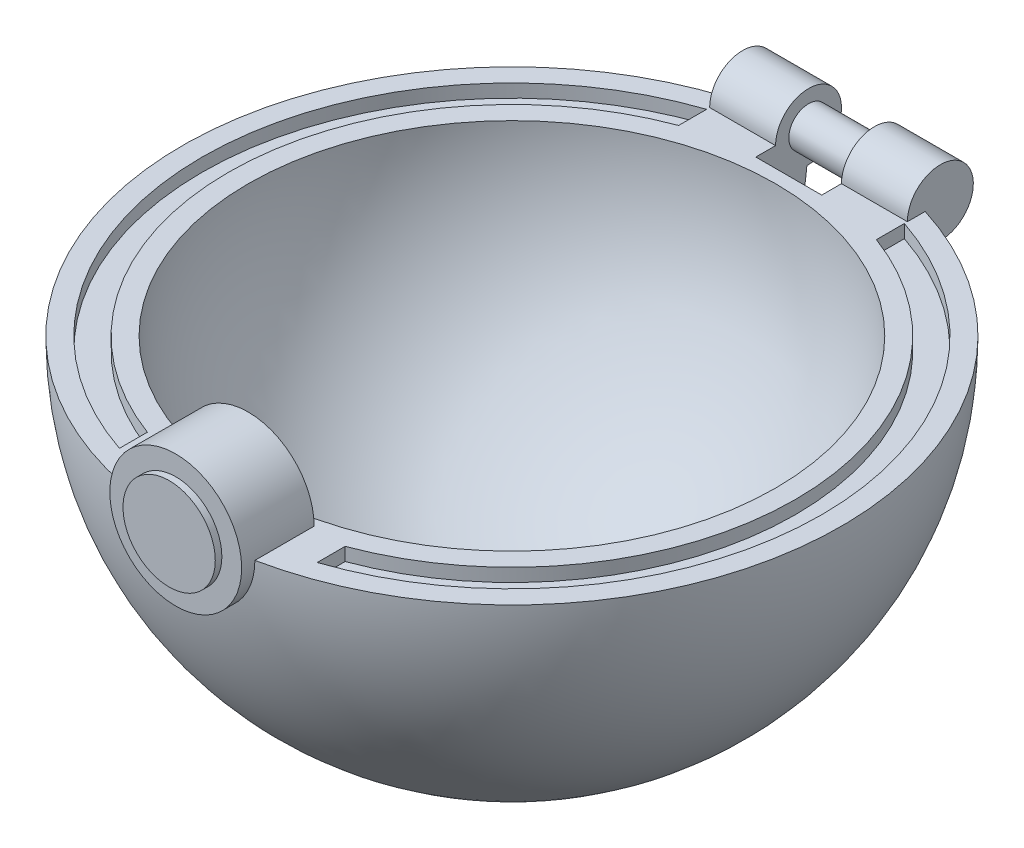
ISO-10303-21;
HEADER;
FILE_DESCRIPTION(('STEP AP214'),'2;1');
FILE_NAME('part.step','',(''),(''),'','','');
FILE_SCHEMA(('AUTOMOTIVE_DESIGN { 1 0 10303 214 1 1 1 1 }'));
ENDSEC;
DATA;
#1=APPLICATION_CONTEXT('core data for automotive mechanical design processes');
#2=APPLICATION_PROTOCOL_DEFINITION('international standard','automotive_design',2000,#1);
#3=PRODUCT_CONTEXT('',#1,'mechanical');
#4=PRODUCT('Part','Part','',(#3));
#5=PRODUCT_RELATED_PRODUCT_CATEGORY('part','',(#4));
#6=PRODUCT_DEFINITION_FORMATION('','',#4);
#7=PRODUCT_DEFINITION_CONTEXT('part definition',#1,'design');
#8=PRODUCT_DEFINITION('design','',#6,#7);
#9=PRODUCT_DEFINITION_SHAPE('','',#8);
#10=(LENGTH_UNIT() NAMED_UNIT(*) SI_UNIT(.MILLI.,.METRE.));
#11=(NAMED_UNIT(*) PLANE_ANGLE_UNIT() SI_UNIT($,.RADIAN.));
#12=(NAMED_UNIT(*) SI_UNIT($,.STERADIAN.) SOLID_ANGLE_UNIT());
#13=UNCERTAINTY_MEASURE_WITH_UNIT(LENGTH_MEASURE(1.E-05),#10,'distance_accuracy_value','');
#14=(GEOMETRIC_REPRESENTATION_CONTEXT(3) GLOBAL_UNCERTAINTY_ASSIGNED_CONTEXT((#13)) GLOBAL_UNIT_ASSIGNED_CONTEXT((#10,
#11,#12)) REPRESENTATION_CONTEXT('',''));
#15=CARTESIAN_POINT('',(0.,0.,0.));
#16=DIRECTION('',(0.,0.,1.));
#17=DIRECTION('',(1.,0.,0.));
#18=AXIS2_PLACEMENT_3D('',#15,#16,#17);
#19=CARTESIAN_POINT('',(-15.,-8.,-49.3558507170123));
#20=DIRECTION('',(0.,-1.,0.));
#21=DIRECTION('',(0.,0.,-1.));
#22=AXIS2_PLACEMENT_3D('',#19,#20,#21);
#23=PLANE('',#22);
#24=DIRECTION('',(1.,0.,0.));
#25=VECTOR('',#24,1.);
#26=CARTESIAN_POINT('',(-15.,-8.,-49.3558507170123));
#27=LINE('',#26,#25);
#28=CARTESIAN_POINT('',(-15.,-8.,-49.3558507170123));
#29=VERTEX_POINT('',#28);
#30=CARTESIAN_POINT('',(-5.,-8.,-49.3558507170123));
#31=VERTEX_POINT('',#30);
#32=EDGE_CURVE('E261',#29,#31,#27,.T.);
#33=ORIENTED_EDGE('',*,*,#32,.T.);
#34=DIRECTION('',(0.,0.,-1.));
#35=VECTOR('',#34,1.);
#36=CARTESIAN_POINT('',(-5.,-8.,-49.3558507170123));
#37=LINE('',#36,#35);
#38=CARTESIAN_POINT('',(-5.,-8.,-49.1019347887637));
#39=VERTEX_POINT('',#38);
#40=EDGE_CURVE('E226',#39,#31,#37,.T.);
#41=ORIENTED_EDGE('',*,*,#40,.F.);
#42=CARTESIAN_POINT('',(0.,-8.00000000000001,0.));
#43=DIRECTION('',(0.,-1.,0.));
#44=DIRECTION('',(0.,0.,-1.));
#45=AXIS2_PLACEMENT_3D('',#42,#43,#44);
#46=CIRCLE('',#45,49.3558507170123);
#47=CARTESIAN_POINT('',(-15.,-8.,-47.021271782035));
#48=VERTEX_POINT('',#47);
#49=EDGE_CURVE('E58',#39,#48,#46,.F.);
#50=ORIENTED_EDGE('',*,*,#49,.T.);
#51=DIRECTION('',(0.,0.,-1.));
#52=VECTOR('',#51,1.);
#53=CARTESIAN_POINT('',(-15.,-8.,-49.3558507170123));
#54=LINE('',#53,#52);
#55=EDGE_CURVE('E250',#48,#29,#54,.T.);
#56=ORIENTED_EDGE('',*,*,#55,.T.);
#57=EDGE_LOOP('',(#33,#41,#50,#56));
#58=FACE_BOUND('',#57,.T.);
#59=ADVANCED_FACE('F35',(#58),#23,.T.);
#60=CARTESIAN_POINT('',(-15.,0.,0.));
#61=DIRECTION('',(1.,0.,0.));
#62=DIRECTION('',(0.,0.,-1.));
#63=AXIS2_PLACEMENT_3D('',#60,#61,#62);
#64=CYLINDRICAL_SURFACE('',#63,50.);
#65=DIRECTION('',(1.,0.,0.));
#66=VECTOR('',#65,1.);
#67=CARTESIAN_POINT('',(-15.,-5.00000000000001,-49.749371855331));
#68=LINE('',#67,#66);
#69=CARTESIAN_POINT('',(-15.,-5.00000000000001,-49.749371855331));
#70=VERTEX_POINT('',#69);
#71=CARTESIAN_POINT('',(-5.,-5.00000000000001,-49.749371855331));
#72=VERTEX_POINT('',#71);
#73=EDGE_CURVE('E256',#70,#72,#68,.T.);
#74=ORIENTED_EDGE('',*,*,#73,.T.);
#75=CARTESIAN_POINT('',(-5.,0.,0.));
#76=DIRECTION('',(1.,0.,0.));
#77=DIRECTION('',(0.,0.,-1.));
#78=AXIS2_PLACEMENT_3D('',#75,#76,#77);
#79=CIRCLE('',#78,50.);
#80=EDGE_CURVE('E225',#31,#72,#79,.T.);
#81=ORIENTED_EDGE('',*,*,#80,.F.);
#82=ORIENTED_EDGE('',*,*,#32,.F.);
#83=CARTESIAN_POINT('',(-15.,0.,0.));
#84=DIRECTION('',(1.,0.,0.));
#85=DIRECTION('',(0.,0.,-1.));
#86=AXIS2_PLACEMENT_3D('',#83,#84,#85);
#87=CIRCLE('',#86,50.);
#88=EDGE_CURVE('E252',#29,#70,#87,.T.);
#89=ORIENTED_EDGE('',*,*,#88,.T.);
#90=EDGE_LOOP('',(#74,#81,#82,#89));
#91=FACE_BOUND('',#90,.T.);
#92=ADVANCED_FACE('F478',(#91),#64,.T.);
#93=CARTESIAN_POINT('',(0.,0.,0.));
#94=DIRECTION('',(0.,-1.,0.));
#95=DIRECTION('',(0.,0.,1.));
#96=AXIS2_PLACEMENT_3D('',#93,#94,#95);
#97=SPHERICAL_SURFACE('',#96,50.);
#98=CARTESIAN_POINT('',(0.,-49.,0.));
#99=DIRECTION('',(0.,1.,0.));
#100=DIRECTION('',(0.,0.,1.));
#101=AXIS2_PLACEMENT_3D('',#98,#99,#100);
#102=CIRCLE('',#101,9.94987437106621);
#103=CARTESIAN_POINT('',(0.,-49.,9.94987437106621));
#104=VERTEX_POINT('',#103);
#105=EDGE_CURVE('E39',#104,#104,#102,.F.);
#106=ORIENTED_EDGE('',*,*,#105,.F.);
#107=EDGE_LOOP('',(#106));
#108=FACE_BOUND('',#107,.T.);
#109=CARTESIAN_POINT('',(-15.,0.,0.));
#110=DIRECTION('',(1.,0.,0.));
#111=DIRECTION('',(0.,0.,-1.));
#112=AXIS2_PLACEMENT_3D('',#109,#110,#111);
#113=CIRCLE('',#112,47.6969600708473);
#114=CARTESIAN_POINT('',(-15.,0.,-47.6969600708473));
#115=VERTEX_POINT('',#114);
#116=EDGE_CURVE('E385',#115,#48,#113,.F.);
#117=ORIENTED_EDGE('',*,*,#116,.T.);
#118=ORIENTED_EDGE('',*,*,#49,.F.);
#119=CARTESIAN_POINT('',(5.,-8.,-49.1019347887637));
#120=VERTEX_POINT('',#119);
#121=EDGE_CURVE('E44',#120,#39,#46,.F.);
#122=ORIENTED_EDGE('',*,*,#121,.F.);
#123=CARTESIAN_POINT('',(15.,-8.,-47.021271782035));
#124=VERTEX_POINT('',#123);
#125=EDGE_CURVE('E415',#124,#120,#46,.F.);
#126=ORIENTED_EDGE('',*,*,#125,.F.);
#127=CARTESIAN_POINT('',(15.,0.,0.));
#128=DIRECTION('',(1.,0.,0.));
#129=DIRECTION('',(0.,0.,-1.));
#130=AXIS2_PLACEMENT_3D('',#127,#128,#129);
#131=CIRCLE('',#130,47.6969600708473);
#132=CARTESIAN_POINT('',(15.,0.,-47.6969600708473));
#133=VERTEX_POINT('',#132);
#134=EDGE_CURVE('E387',#133,#124,#131,.F.);
#135=ORIENTED_EDGE('',*,*,#134,.F.);
#136=CARTESIAN_POINT('',(0.,0.,0.));
#137=DIRECTION('',(0.,-1.,0.));
#138=DIRECTION('',(0.,0.,-1.));
#139=AXIS2_PLACEMENT_3D('',#136,#137,#138);
#140=CIRCLE('',#139,50.);
#141=CARTESIAN_POINT('',(10.,0.,48.9897948556636));
#142=VERTEX_POINT('',#141);
#143=EDGE_CURVE('E393',#133,#142,#140,.T.);
#144=ORIENTED_EDGE('',*,*,#143,.T.);
#145=CARTESIAN_POINT('',(0.,0.,48.9897948556636));
#146=DIRECTION('',(0.,0.,-1.));
#147=DIRECTION('',(-1.,0.,0.));
#148=AXIS2_PLACEMENT_3D('',#145,#146,#147);
#149=CIRCLE('',#148,10.);
#150=CARTESIAN_POINT('',(-10.,0.,48.9897948556636));
#151=VERTEX_POINT('',#150);
#152=EDGE_CURVE('E339',#151,#142,#149,.F.);
#153=ORIENTED_EDGE('',*,*,#152,.F.);
#154=EDGE_CURVE('E392',#151,#115,#140,.T.);
#155=ORIENTED_EDGE('',*,*,#154,.T.);
#156=EDGE_LOOP('',(#117,#118,#122,#126,#135,#144,#153,#155));
#157=FACE_BOUND('',#156,.T.);
#158=ADVANCED_FACE('F426',(#108,#157),#97,.T.);
#159=CARTESIAN_POINT('',(-15.,0.,-50.));
#160=DIRECTION('',(1.,0.,0.));
#161=DIRECTION('',(0.,0.,-1.));
#162=AXIS2_PLACEMENT_3D('',#159,#160,#161);
#163=CYLINDRICAL_SURFACE('',#162,5.);
#164=CARTESIAN_POINT('',(-5.,0.,-50.));
#165=DIRECTION('',(1.,0.,0.));
#166=DIRECTION('',(0.,0.,-1.));
#167=AXIS2_PLACEMENT_3D('',#164,#165,#166);
#168=CIRCLE('',#167,5.);
#169=CARTESIAN_POINT('',(-5.,-5.,-50.));
#170=VERTEX_POINT('',#169);
#171=CARTESIAN_POINT('',(-5.,0.,-45.));
#172=VERTEX_POINT('',#171);
#173=EDGE_CURVE('E375',#170,#172,#168,.T.);
#174=ORIENTED_EDGE('',*,*,#173,.F.);
#175=DIRECTION('',(1.,0.,0.));
#176=VECTOR('',#175,1.);
#177=CARTESIAN_POINT('',(-15.,-5.,-50.));
#178=LINE('',#177,#176);
#179=CARTESIAN_POINT('',(-15.,-5.,-50.));
#180=VERTEX_POINT('',#179);
#181=EDGE_CURVE('E345',#180,#170,#178,.T.);
#182=ORIENTED_EDGE('',*,*,#181,.F.);
#183=CARTESIAN_POINT('',(-15.,0.,-50.));
#184=DIRECTION('',(1.,0.,0.));
#185=DIRECTION('',(0.,0.,-1.));
#186=AXIS2_PLACEMENT_3D('',#183,#184,#185);
#187=CIRCLE('',#186,5.);
#188=CARTESIAN_POINT('',(-15.,0.,-45.));
#189=VERTEX_POINT('',#188);
#190=EDGE_CURVE('E383',#180,#189,#187,.T.);
#191=ORIENTED_EDGE('',*,*,#190,.T.);
#192=DIRECTION('',(1.,0.,0.));
#193=VECTOR('',#192,1.);
#194=CARTESIAN_POINT('',(-15.,0.,-45.));
#195=LINE('',#194,#193);
#196=EDGE_CURVE('E354',#172,#189,#195,.F.);
#197=ORIENTED_EDGE('',*,*,#196,.F.);
#198=EDGE_LOOP('',(#174,#182,#191,#197));
#199=FACE_BOUND('',#198,.T.);
#200=ADVANCED_FACE('F445',(#199),#163,.T.);
#201=CARTESIAN_POINT('',(15.,0.,-50.));
#202=DIRECTION('',(1.,0.,0.));
#203=DIRECTION('',(0.,0.,-1.));
#204=AXIS2_PLACEMENT_3D('',#201,#202,#203);
#205=CIRCLE('',#204,5.);
#206=CARTESIAN_POINT('',(15.,-5.,-50.));
#207=VERTEX_POINT('',#206);
#208=CARTESIAN_POINT('',(15.,0.,-45.));
#209=VERTEX_POINT('',#208);
#210=EDGE_CURVE('E380',#207,#209,#205,.T.);
#211=ORIENTED_EDGE('',*,*,#210,.F.);
#212=DIRECTION('',(1.,0.,0.));
#213=VECTOR('',#212,1.);
#214=CARTESIAN_POINT('',(5.,-5.,-50.));
#215=LINE('',#214,#213);
#216=CARTESIAN_POINT('',(5.,-5.,-50.));
#217=VERTEX_POINT('',#216);
#218=EDGE_CURVE('E363',#217,#207,#215,.T.);
#219=ORIENTED_EDGE('',*,*,#218,.F.);
#220=CARTESIAN_POINT('',(5.,0.,-50.));
#221=DIRECTION('',(1.,0.,0.));
#222=DIRECTION('',(0.,0.,-1.));
#223=AXIS2_PLACEMENT_3D('',#220,#221,#222);
#224=CIRCLE('',#223,5.);
#225=CARTESIAN_POINT('',(5.,0.,-45.));
#226=VERTEX_POINT('',#225);
#227=EDGE_CURVE('E377',#217,#226,#224,.T.);
#228=ORIENTED_EDGE('',*,*,#227,.T.);
#229=DIRECTION('',(1.,0.,0.));
#230=VECTOR('',#229,1.);
#231=CARTESIAN_POINT('',(-15.,0.,-45.));
#232=LINE('',#231,#230);
#233=EDGE_CURVE('E370',#209,#226,#232,.F.);
#234=ORIENTED_EDGE('',*,*,#233,.F.);
#235=EDGE_LOOP('',(#211,#219,#228,#234));
#236=FACE_BOUND('',#235,.T.);
#237=ADVANCED_FACE('F468',(#236),#163,.T.);
#238=CARTESIAN_POINT('',(0.,0.,0.));
#239=DIRECTION('',(0.,-1.,0.));
#240=DIRECTION('',(0.,0.,1.));
#241=AXIS2_PLACEMENT_3D('',#238,#239,#240);
#242=SPHERICAL_SURFACE('',#241,40.);
#243=CARTESIAN_POINT('',(0.,0.,0.));
#244=DIRECTION('',(0.,-1.,0.));
#245=DIRECTION('',(0.,0.,-1.));
#246=AXIS2_PLACEMENT_3D('',#243,#244,#245);
#247=CIRCLE('',#246,40.);
#248=CARTESIAN_POINT('',(0.,0.,40.));
#249=VERTEX_POINT('',#248);
#250=EDGE_CURVE('E389',#249,#249,#247,.T.);
#251=ORIENTED_EDGE('',*,*,#250,.F.);
#252=EDGE_LOOP('',(#251));
#253=FACE_BOUND('',#252,.T.);
#254=ADVANCED_FACE('F37',(#253),#242,.F.);
#255=CARTESIAN_POINT('',(0.,0.,0.));
#256=DIRECTION('',(0.,-1.,0.));
#257=DIRECTION('',(0.,0.,-1.));
#258=AXIS2_PLACEMENT_3D('',#255,#256,#257);
#259=PLANE('',#258);
#260=DIRECTION('',(0.,0.,-1.));
#261=VECTOR('',#260,1.);
#262=CARTESIAN_POINT('',(-15.,0.,40.2988833592198));
#263=LINE('',#262,#261);
#264=CARTESIAN_POINT('',(-15.,0.,44.5420948942008));
#265=VERTEX_POINT('',#264);
#266=CARTESIAN_POINT('',(-15.,0.,40.2988833592198));
#267=VERTEX_POINT('',#266);
#268=EDGE_CURVE('E281',#265,#267,#263,.T.);
#269=ORIENTED_EDGE('',*,*,#268,.F.);
#270=CARTESIAN_POINT('',(0.,0.,0.));
#271=DIRECTION('',(0.,1.,0.));
#272=DIRECTION('',(0.,0.,1.));
#273=AXIS2_PLACEMENT_3D('',#270,#271,#272);
#274=CIRCLE('',#273,46.9999810379109);
#275=CARTESIAN_POINT('',(-15.,0.,-44.5420948942008));
#276=VERTEX_POINT('',#275);
#277=EDGE_CURVE('E265',#276,#265,#274,.T.);
#278=ORIENTED_EDGE('',*,*,#277,.F.);
#279=DIRECTION('',(0.,0.,-1.));
#280=VECTOR('',#279,1.);
#281=CARTESIAN_POINT('',(-15.,0.,-44.5420948942008));
#282=LINE('',#281,#280);
#283=CARTESIAN_POINT('',(-15.,0.,-40.2988833592198));
#284=VERTEX_POINT('',#283);
#285=EDGE_CURVE('E270',#284,#276,#282,.T.);
#286=ORIENTED_EDGE('',*,*,#285,.F.);
#287=CARTESIAN_POINT('',(0.,0.,0.));
#288=DIRECTION('',(0.,-1.,0.));
#289=DIRECTION('',(0.,0.,1.));
#290=AXIS2_PLACEMENT_3D('',#287,#288,#289);
#291=CIRCLE('',#290,43.);
#292=EDGE_CURVE('E284',#267,#284,#291,.T.);
#293=ORIENTED_EDGE('',*,*,#292,.F.);
#294=EDGE_LOOP('',(#269,#278,#286,#293));
#295=FACE_BOUND('',#294,.T.);
#296=DIRECTION('',(0.,0.,1.));
#297=VECTOR('',#296,1.);
#298=CARTESIAN_POINT('',(15.,0.,-44.5420948942008));
#299=LINE('',#298,#297);
#300=CARTESIAN_POINT('',(15.,0.,-44.5420948942008));
#301=VERTEX_POINT('',#300);
#302=CARTESIAN_POINT('',(15.,0.,-40.2988833592198));
#303=VERTEX_POINT('',#302);
#304=EDGE_CURVE('E313',#301,#303,#299,.T.);
#305=ORIENTED_EDGE('',*,*,#304,.F.);
#306=CARTESIAN_POINT('',(0.,0.,0.));
#307=DIRECTION('',(0.,1.,0.));
#308=DIRECTION('',(0.,0.,1.));
#309=AXIS2_PLACEMENT_3D('',#306,#307,#308);
#310=CIRCLE('',#309,46.9999810379109);
#311=CARTESIAN_POINT('',(15.,0.,44.5420948942008));
#312=VERTEX_POINT('',#311);
#313=EDGE_CURVE('E291',#312,#301,#310,.T.);
#314=ORIENTED_EDGE('',*,*,#313,.F.);
#315=DIRECTION('',(0.,0.,1.));
#316=VECTOR('',#315,1.);
#317=CARTESIAN_POINT('',(15.,0.,40.2988833592198));
#318=LINE('',#317,#316);
#319=CARTESIAN_POINT('',(15.,0.,40.2988833592198));
#320=VERTEX_POINT('',#319);
#321=EDGE_CURVE('E302',#320,#312,#318,.T.);
#322=ORIENTED_EDGE('',*,*,#321,.F.);
#323=CARTESIAN_POINT('',(0.,0.,0.));
#324=DIRECTION('',(0.,-1.,0.));
#325=DIRECTION('',(0.,0.,1.));
#326=AXIS2_PLACEMENT_3D('',#323,#324,#325);
#327=CIRCLE('',#326,43.);
#328=EDGE_CURVE('E316',#303,#320,#327,.T.);
#329=ORIENTED_EDGE('',*,*,#328,.F.);
#330=EDGE_LOOP('',(#305,#314,#322,#329));
#331=FACE_BOUND('',#330,.T.);
#332=DIRECTION('',(-1.,0.,0.));
#333=VECTOR('',#332,1.);
#334=CARTESIAN_POINT('',(0.,0.,40.));
#335=LINE('',#334,#333);
#336=CARTESIAN_POINT('',(10.,0.,40.));
#337=VERTEX_POINT('',#336);
#338=EDGE_CURVE('E410',#337,#249,#335,.T.);
#339=ORIENTED_EDGE('',*,*,#338,.F.);
#340=DIRECTION('',(0.,0.,1.));
#341=VECTOR('',#340,1.);
#342=CARTESIAN_POINT('',(10.,0.,40.));
#343=LINE('',#342,#341);
#344=EDGE_CURVE('E413',#337,#142,#343,.T.);
#345=ORIENTED_EDGE('',*,*,#344,.T.);
#346=ORIENTED_EDGE('',*,*,#143,.F.);
#347=DIRECTION('',(0.,0.,1.));
#348=VECTOR('',#347,1.);
#349=CARTESIAN_POINT('',(15.,0.,0.));
#350=LINE('',#349,#348);
#351=EDGE_CURVE('E401',#133,#209,#350,.T.);
#352=ORIENTED_EDGE('',*,*,#351,.T.);
#353=ORIENTED_EDGE('',*,*,#233,.T.);
#354=DIRECTION('',(0.,0.,1.));
#355=VECTOR('',#354,1.);
#356=CARTESIAN_POINT('',(5.,0.,-50.));
#357=LINE('',#356,#355);
#358=CARTESIAN_POINT('',(5.,0.,-42.));
#359=VERTEX_POINT('',#358);
#360=EDGE_CURVE('E358',#226,#359,#357,.T.);
#361=ORIENTED_EDGE('',*,*,#360,.T.);
#362=DIRECTION('',(-1.,0.,0.));
#363=VECTOR('',#362,1.);
#364=CARTESIAN_POINT('',(15.,0.,-42.));
#365=LINE('',#364,#363);
#366=CARTESIAN_POINT('',(-5.,0.,-42.));
#367=VERTEX_POINT('',#366);
#368=EDGE_CURVE('E399',#367,#359,#365,.F.);
#369=ORIENTED_EDGE('',*,*,#368,.F.);
#370=DIRECTION('',(0.,0.,1.));
#371=VECTOR('',#370,1.);
#372=CARTESIAN_POINT('',(-5.,0.,-50.));
#373=LINE('',#372,#371);
#374=EDGE_CURVE('E342',#172,#367,#373,.T.);
#375=ORIENTED_EDGE('',*,*,#374,.F.);
#376=ORIENTED_EDGE('',*,*,#196,.T.);
#377=DIRECTION('',(0.,0.,1.));
#378=VECTOR('',#377,1.);
#379=CARTESIAN_POINT('',(-15.,0.,0.));
#380=LINE('',#379,#378);
#381=EDGE_CURVE('E396',#115,#189,#380,.T.);
#382=ORIENTED_EDGE('',*,*,#381,.F.);
#383=ORIENTED_EDGE('',*,*,#154,.F.);
#384=DIRECTION('',(0.,0.,1.));
#385=VECTOR('',#384,1.);
#386=CARTESIAN_POINT('',(-10.,0.,40.));
#387=LINE('',#386,#385);
#388=CARTESIAN_POINT('',(-10.,0.,40.));
#389=VERTEX_POINT('',#388);
#390=EDGE_CURVE('E411',#151,#389,#387,.F.);
#391=ORIENTED_EDGE('',*,*,#390,.T.);
#392=EDGE_CURVE('E407',#249,#389,#335,.T.);
#393=ORIENTED_EDGE('',*,*,#392,.F.);
#394=ORIENTED_EDGE('',*,*,#250,.T.);
#395=EDGE_LOOP('',(#339,#345,#346,#352,#353,#361,#369,#375,#376,#382,#383,#391,#393,#394));
#396=FACE_BOUND('',#395,.T.);
#397=ADVANCED_FACE('F440',(#295,#331,#396),#259,.F.);
#398=CARTESIAN_POINT('',(15.,0.,-50.));
#399=DIRECTION('',(-1.,0.,0.));
#400=DIRECTION('',(0.,0.,1.));
#401=AXIS2_PLACEMENT_3D('',#398,#399,#400);
#402=CYLINDRICAL_SURFACE('',#401,8.);
#403=DIRECTION('',(-1.,0.,0.));
#404=VECTOR('',#403,1.);
#405=CARTESIAN_POINT('',(15.,-5.,-43.7550020016016));
#406=LINE('',#405,#404);
#407=CARTESIAN_POINT('',(-5.,-5.,-43.7550020016016));
#408=VERTEX_POINT('',#407);
#409=CARTESIAN_POINT('',(5.,-5.,-43.7550020016016));
#410=VERTEX_POINT('',#409);
#411=EDGE_CURVE('E259',#408,#410,#406,.F.);
#412=ORIENTED_EDGE('',*,*,#411,.F.);
#413=CARTESIAN_POINT('',(-5.,0.,-50.));
#414=DIRECTION('',(-1.,0.,0.));
#415=DIRECTION('',(0.,0.,1.));
#416=AXIS2_PLACEMENT_3D('',#413,#414,#415);
#417=CIRCLE('',#416,8.);
#418=EDGE_CURVE('E352',#408,#367,#417,.T.);
#419=ORIENTED_EDGE('',*,*,#418,.T.);
#420=ORIENTED_EDGE('',*,*,#368,.T.);
#421=CARTESIAN_POINT('',(5.,0.,-50.));
#422=DIRECTION('',(-1.,0.,0.));
#423=DIRECTION('',(0.,0.,1.));
#424=AXIS2_PLACEMENT_3D('',#421,#422,#423);
#425=CIRCLE('',#424,8.);
#426=EDGE_CURVE('E367',#410,#359,#425,.T.);
#427=ORIENTED_EDGE('',*,*,#426,.F.);
#428=EDGE_LOOP('',(#412,#419,#420,#427));
#429=FACE_BOUND('',#428,.T.);
#430=ADVANCED_FACE('F436',(#429),#402,.F.);
#431=CARTESIAN_POINT('',(-15.,0.,-50.));
#432=DIRECTION('',(1.,0.,0.));
#433=DIRECTION('',(0.,0.,-1.));
#434=AXIS2_PLACEMENT_3D('',#431,#432,#433);
#435=PLANE('',#434);
#436=ORIENTED_EDGE('',*,*,#190,.F.);
#437=DIRECTION('',(0.,0.,-1.));
#438=VECTOR('',#437,1.);
#439=CARTESIAN_POINT('',(-15.,-5.,-50.));
#440=LINE('',#439,#438);
#441=EDGE_CURVE('E343',#70,#180,#440,.T.);
#442=ORIENTED_EDGE('',*,*,#441,.F.);
#443=ORIENTED_EDGE('',*,*,#88,.F.);
#444=ORIENTED_EDGE('',*,*,#55,.F.);
#445=ORIENTED_EDGE('',*,*,#116,.F.);
#446=ORIENTED_EDGE('',*,*,#381,.T.);
#447=EDGE_LOOP('',(#436,#442,#443,#444,#445,#446));
#448=FACE_BOUND('',#447,.T.);
#449=ADVANCED_FACE('F452',(#448),#435,.F.);
#450=CARTESIAN_POINT('',(15.,0.,-50.));
#451=DIRECTION('',(1.,0.,0.));
#452=DIRECTION('',(0.,0.,-1.));
#453=AXIS2_PLACEMENT_3D('',#450,#451,#452);
#454=PLANE('',#453);
#455=ORIENTED_EDGE('',*,*,#134,.T.);
#456=DIRECTION('',(0.,0.,-1.));
#457=VECTOR('',#456,1.);
#458=CARTESIAN_POINT('',(15.,-8.,-49.3558507170123));
#459=LINE('',#458,#457);
#460=CARTESIAN_POINT('',(15.,-8.,-49.3558507170123));
#461=VERTEX_POINT('',#460);
#462=EDGE_CURVE('E218',#124,#461,#459,.T.);
#463=ORIENTED_EDGE('',*,*,#462,.T.);
#464=CARTESIAN_POINT('',(15.,0.,0.));
#465=DIRECTION('',(1.,0.,0.));
#466=DIRECTION('',(0.,0.,-1.));
#467=AXIS2_PLACEMENT_3D('',#464,#465,#466);
#468=CIRCLE('',#467,50.);
#469=CARTESIAN_POINT('',(15.,-5.,-49.749371855331));
#470=VERTEX_POINT('',#469);
#471=EDGE_CURVE('E247',#461,#470,#468,.T.);
#472=ORIENTED_EDGE('',*,*,#471,.T.);
#473=DIRECTION('',(0.,0.,-1.));
#474=VECTOR('',#473,1.);
#475=CARTESIAN_POINT('',(15.,-5.,-50.));
#476=LINE('',#475,#474);
#477=EDGE_CURVE('E357',#470,#207,#476,.T.);
#478=ORIENTED_EDGE('',*,*,#477,.T.);
#479=ORIENTED_EDGE('',*,*,#210,.T.);
#480=ORIENTED_EDGE('',*,*,#351,.F.);
#481=EDGE_LOOP('',(#455,#463,#472,#478,#479,#480));
#482=FACE_BOUND('',#481,.T.);
#483=ADVANCED_FACE('F522',(#482),#454,.T.);
#484=CARTESIAN_POINT('',(-5.,0.,-50.));
#485=DIRECTION('',(1.,0.,0.));
#486=DIRECTION('',(0.,0.,-1.));
#487=AXIS2_PLACEMENT_3D('',#484,#485,#486);
#488=PLANE('',#487);
#489=CARTESIAN_POINT('',(-5.,0.,-50.));
#490=DIRECTION('',(1.,0.,0.));
#491=DIRECTION('',(0.,0.,-1.));
#492=AXIS2_PLACEMENT_3D('',#489,#490,#491);
#493=CIRCLE('',#492,3.00000000000001);
#494=CARTESIAN_POINT('',(-5.,0.,-53.));
#495=VERTEX_POINT('',#494);
#496=EDGE_CURVE('E404',#495,#495,#493,.T.);
#497=ORIENTED_EDGE('',*,*,#496,.F.);
#498=EDGE_LOOP('',(#497));
#499=FACE_BOUND('',#498,.T.);
#500=ORIENTED_EDGE('',*,*,#173,.T.);
#501=ORIENTED_EDGE('',*,*,#374,.T.);
#502=ORIENTED_EDGE('',*,*,#418,.F.);
#503=DIRECTION('',(0.,0.,1.));
#504=VECTOR('',#503,1.);
#505=CARTESIAN_POINT('',(-5.,-5.,-49.749371855331));
#506=LINE('',#505,#504);
#507=CARTESIAN_POINT('',(-5.,-5.,-40.));
#508=VERTEX_POINT('',#507);
#509=EDGE_CURVE('E231',#408,#508,#506,.T.);
#510=ORIENTED_EDGE('',*,*,#509,.T.);
#511=DIRECTION('',(0.,-1.,0.));
#512=VECTOR('',#511,1.);
#513=CARTESIAN_POINT('',(-5.,-5.,-40.));
#514=LINE('',#513,#512);
#515=CARTESIAN_POINT('',(-5.,-8.,-40.));
#516=VERTEX_POINT('',#515);
#517=EDGE_CURVE('E213',#508,#516,#514,.T.);
#518=ORIENTED_EDGE('',*,*,#517,.T.);
#519=EDGE_CURVE('E222',#516,#39,#37,.T.);
#520=ORIENTED_EDGE('',*,*,#519,.T.);
#521=ORIENTED_EDGE('',*,*,#40,.T.);
#522=ORIENTED_EDGE('',*,*,#80,.T.);
#523=DIRECTION('',(0.,0.,-1.));
#524=VECTOR('',#523,1.);
#525=CARTESIAN_POINT('',(-5.,-5.,-50.));
#526=LINE('',#525,#524);
#527=EDGE_CURVE('E346',#72,#170,#526,.T.);
#528=ORIENTED_EDGE('',*,*,#527,.T.);
#529=EDGE_LOOP('',(#500,#501,#502,#510,#518,#520,#521,#522,#528));
#530=FACE_BOUND('',#529,.T.);
#531=ADVANCED_FACE('F229',(#499,#530),#488,.T.);
#532=CARTESIAN_POINT('',(5.,0.,-50.));
#533=DIRECTION('',(1.,0.,0.));
#534=DIRECTION('',(0.,0.,-1.));
#535=AXIS2_PLACEMENT_3D('',#532,#533,#534);
#536=PLANE('',#535);
#537=CARTESIAN_POINT('',(5.,0.,-50.));
#538=DIRECTION('',(1.,0.,0.));
#539=DIRECTION('',(0.,0.,-1.));
#540=AXIS2_PLACEMENT_3D('',#537,#538,#539);
#541=CIRCLE('',#540,3.00000000000001);
#542=CARTESIAN_POINT('',(5.,0.,-53.));
#543=VERTEX_POINT('',#542);
#544=EDGE_CURVE('E372',#543,#543,#541,.T.);
#545=ORIENTED_EDGE('',*,*,#544,.T.);
#546=EDGE_LOOP('',(#545));
#547=FACE_BOUND('',#546,.T.);
#548=ORIENTED_EDGE('',*,*,#227,.F.);
#549=DIRECTION('',(0.,0.,-1.));
#550=VECTOR('',#549,1.);
#551=CARTESIAN_POINT('',(5.,-5.,-50.));
#552=LINE('',#551,#550);
#553=CARTESIAN_POINT('',(5.,-5.00000000000001,-49.749371855331));
#554=VERTEX_POINT('',#553);
#555=EDGE_CURVE('E361',#554,#217,#552,.T.);
#556=ORIENTED_EDGE('',*,*,#555,.F.);
#557=CARTESIAN_POINT('',(5.,0.,0.));
#558=DIRECTION('',(1.,0.,0.));
#559=DIRECTION('',(0.,0.,-1.));
#560=AXIS2_PLACEMENT_3D('',#557,#558,#559);
#561=CIRCLE('',#560,50.);
#562=CARTESIAN_POINT('',(5.,-8.,-49.3558507170123));
#563=VERTEX_POINT('',#562);
#564=EDGE_CURVE('E50',#563,#554,#561,.T.);
#565=ORIENTED_EDGE('',*,*,#564,.F.);
#566=DIRECTION('',(0.,0.,1.));
#567=VECTOR('',#566,1.);
#568=CARTESIAN_POINT('',(5.,-8.,-49.3558507170123));
#569=LINE('',#568,#567);
#570=EDGE_CURVE('E11',#563,#120,#569,.T.);
#571=ORIENTED_EDGE('',*,*,#570,.T.);
#572=DIRECTION('',(0.,0.,-1.));
#573=VECTOR('',#572,1.);
#574=CARTESIAN_POINT('',(5.,-8.,-49.3558507170123));
#575=LINE('',#574,#573);
#576=CARTESIAN_POINT('',(5.,-8.,-40.));
#577=VERTEX_POINT('',#576);
#578=EDGE_CURVE('E239',#577,#120,#575,.T.);
#579=ORIENTED_EDGE('',*,*,#578,.F.);
#580=DIRECTION('',(0.,-1.,0.));
#581=VECTOR('',#580,1.);
#582=CARTESIAN_POINT('',(5.,-5.,-40.));
#583=LINE('',#582,#581);
#584=CARTESIAN_POINT('',(5.,-5.,-40.));
#585=VERTEX_POINT('',#584);
#586=EDGE_CURVE('E215',#585,#577,#583,.T.);
#587=ORIENTED_EDGE('',*,*,#586,.F.);
#588=DIRECTION('',(0.,0.,1.));
#589=VECTOR('',#588,1.);
#590=CARTESIAN_POINT('',(5.,-5.,-49.749371855331));
#591=LINE('',#590,#589);
#592=EDGE_CURVE('E242',#410,#585,#591,.T.);
#593=ORIENTED_EDGE('',*,*,#592,.F.);
#594=ORIENTED_EDGE('',*,*,#426,.T.);
#595=ORIENTED_EDGE('',*,*,#360,.F.);
#596=EDGE_LOOP('',(#548,#556,#565,#571,#579,#587,#593,#594,#595));
#597=FACE_BOUND('',#596,.T.);
#598=ADVANCED_FACE('F429',(#547,#597),#536,.F.);
#599=CARTESIAN_POINT('',(-5.,0.,-50.));
#600=DIRECTION('',(1.,0.,0.));
#601=DIRECTION('',(0.,0.,-1.));
#602=AXIS2_PLACEMENT_3D('',#599,#600,#601);
#603=CYLINDRICAL_SURFACE('',#602,3.00000000000001);
#604=ORIENTED_EDGE('',*,*,#496,.T.);
#605=EDGE_LOOP('',(#604));
#606=FACE_BOUND('',#605,.T.);
#607=ORIENTED_EDGE('',*,*,#544,.F.);
#608=EDGE_LOOP('',(#607));
#609=FACE_BOUND('',#608,.T.);
#610=ADVANCED_FACE('F528',(#606,#609),#603,.T.);
#611=CARTESIAN_POINT('',(5.,-5.,-50.));
#612=DIRECTION('',(0.,-1.,0.));
#613=DIRECTION('',(0.,0.,-1.));
#614=AXIS2_PLACEMENT_3D('',#611,#612,#613);
#615=PLANE('',#614);
#616=EDGE_CURVE('E260',#554,#470,#68,.T.);
#617=ORIENTED_EDGE('',*,*,#616,.F.);
#618=ORIENTED_EDGE('',*,*,#555,.T.);
#619=ORIENTED_EDGE('',*,*,#218,.T.);
#620=ORIENTED_EDGE('',*,*,#477,.F.);
#621=EDGE_LOOP('',(#617,#618,#619,#620));
#622=FACE_BOUND('',#621,.T.);
#623=ADVANCED_FACE('F535',(#622),#615,.T.);
#624=CARTESIAN_POINT('',(-15.,-5.,-50.));
#625=DIRECTION('',(0.,-1.,0.));
#626=DIRECTION('',(0.,0.,-1.));
#627=AXIS2_PLACEMENT_3D('',#624,#625,#626);
#628=PLANE('',#627);
#629=ORIENTED_EDGE('',*,*,#73,.F.);
#630=ORIENTED_EDGE('',*,*,#441,.T.);
#631=ORIENTED_EDGE('',*,*,#181,.T.);
#632=ORIENTED_EDGE('',*,*,#527,.F.);
#633=EDGE_LOOP('',(#629,#630,#631,#632));
#634=FACE_BOUND('',#633,.T.);
#635=ADVANCED_FACE('F449',(#634),#628,.T.);
#636=CARTESIAN_POINT('',(0.,0.,40.));
#637=DIRECTION('',(0.,0.,1.));
#638=DIRECTION('',(1.,0.,0.));
#639=AXIS2_PLACEMENT_3D('',#636,#637,#638);
#640=CYLINDRICAL_SURFACE('',#639,10.);
#641=CARTESIAN_POINT('',(0.,0.,51.));
#642=DIRECTION('',(0.,0.,1.));
#643=DIRECTION('',(1.,0.,0.));
#644=AXIS2_PLACEMENT_3D('',#641,#642,#643);
#645=CIRCLE('',#644,10.);
#646=CARTESIAN_POINT('',(10.,0.,51.));
#647=VERTEX_POINT('',#646);
#648=EDGE_CURVE('E333',#647,#647,#645,.T.);
#649=ORIENTED_EDGE('',*,*,#648,.F.);
#650=EDGE_LOOP('',(#649));
#651=FACE_BOUND('',#650,.T.);
#652=ORIENTED_EDGE('',*,*,#344,.F.);
#653=CARTESIAN_POINT('',(0.,0.,40.));
#654=DIRECTION('',(0.,0.,1.));
#655=DIRECTION('',(1.,0.,0.));
#656=AXIS2_PLACEMENT_3D('',#653,#654,#655);
#657=CIRCLE('',#656,10.);
#658=EDGE_CURVE('E336',#337,#389,#657,.T.);
#659=ORIENTED_EDGE('',*,*,#658,.T.);
#660=ORIENTED_EDGE('',*,*,#390,.F.);
#661=ORIENTED_EDGE('',*,*,#152,.T.);
#662=EDGE_LOOP('',(#652,#659,#660,#661));
#663=FACE_BOUND('',#662,.T.);
#664=ADVANCED_FACE('F460',(#651,#663),#640,.T.);
#665=CARTESIAN_POINT('',(0.,0.,40.));
#666=DIRECTION('',(0.,0.,1.));
#667=DIRECTION('',(1.,0.,0.));
#668=AXIS2_PLACEMENT_3D('',#665,#666,#667);
#669=PLANE('',#668);
#670=ORIENTED_EDGE('',*,*,#658,.F.);
#671=ORIENTED_EDGE('',*,*,#338,.T.);
#672=ORIENTED_EDGE('',*,*,#392,.T.);
#673=EDGE_LOOP('',(#670,#671,#672));
#674=FACE_BOUND('',#673,.T.);
#675=ADVANCED_FACE('F464',(#674),#669,.F.);
#676=CARTESIAN_POINT('',(0.,0.,51.));
#677=DIRECTION('',(0.,0.,1.));
#678=DIRECTION('',(1.,0.,0.));
#679=AXIS2_PLACEMENT_3D('',#676,#677,#678);
#680=PLANE('',#679);
#681=CARTESIAN_POINT('',(0.,0.,51.));
#682=DIRECTION('',(0.,0.,1.));
#683=DIRECTION('',(1.,0.,0.));
#684=AXIS2_PLACEMENT_3D('',#681,#682,#683);
#685=CIRCLE('',#684,7.);
#686=CARTESIAN_POINT('',(7.,0.,51.));
#687=VERTEX_POINT('',#686);
#688=EDGE_CURVE('E332',#687,#687,#685,.F.);
#689=ORIENTED_EDGE('',*,*,#688,.T.);
#690=EDGE_LOOP('',(#689));
#691=FACE_BOUND('',#690,.T.);
#692=ORIENTED_EDGE('',*,*,#648,.T.);
#693=EDGE_LOOP('',(#692));
#694=FACE_BOUND('',#693,.T.);
#695=ADVANCED_FACE('F547',(#691,#694),#680,.T.);
#696=CARTESIAN_POINT('',(0.,0.,52.));
#697=DIRECTION('',(0.,0.,-1.));
#698=DIRECTION('',(-1.,0.,0.));
#699=AXIS2_PLACEMENT_3D('',#696,#697,#698);
#700=CYLINDRICAL_SURFACE('',#699,7.);
#701=ORIENTED_EDGE('',*,*,#688,.F.);
#702=EDGE_LOOP('',(#701));
#703=FACE_BOUND('',#702,.T.);
#704=CARTESIAN_POINT('',(0.,0.,52.));
#705=DIRECTION('',(0.,0.,1.));
#706=DIRECTION('',(1.,0.,0.));
#707=AXIS2_PLACEMENT_3D('',#704,#705,#706);
#708=CIRCLE('',#707,7.);
#709=CARTESIAN_POINT('',(7.,0.,52.));
#710=VERTEX_POINT('',#709);
#711=EDGE_CURVE('E323',#710,#710,#708,.T.);
#712=ORIENTED_EDGE('',*,*,#711,.F.);
#713=EDGE_LOOP('',(#712));
#714=FACE_BOUND('',#713,.T.);
#715=ADVANCED_FACE('F550',(#703,#714),#700,.T.);
#716=CARTESIAN_POINT('',(0.,0.,52.));
#717=DIRECTION('',(0.,0.,1.));
#718=DIRECTION('',(1.,0.,0.));
#719=AXIS2_PLACEMENT_3D('',#716,#717,#718);
#720=PLANE('',#719);
#721=ORIENTED_EDGE('',*,*,#711,.T.);
#722=EDGE_LOOP('',(#721));
#723=FACE_BOUND('',#722,.T.);
#724=ADVANCED_FACE('F554',(#723),#720,.T.);
#725=CARTESIAN_POINT('',(0.,-2.,0.));
#726=DIRECTION('',(0.,1.,0.));
#727=DIRECTION('',(0.,0.,1.));
#728=AXIS2_PLACEMENT_3D('',#725,#726,#727);
#729=CYLINDRICAL_SURFACE('',#728,46.9999810379109);
#730=ORIENTED_EDGE('',*,*,#313,.T.);
#731=DIRECTION('',(0.,1.,0.));
#732=VECTOR('',#731,1.);
#733=CARTESIAN_POINT('',(15.,-2.,-44.5420948942008));
#734=LINE('',#733,#732);
#735=CARTESIAN_POINT('',(15.,-2.,-44.5420948942008));
#736=VERTEX_POINT('',#735);
#737=EDGE_CURVE('E311',#736,#301,#734,.T.);
#738=ORIENTED_EDGE('',*,*,#737,.F.);
#739=CARTESIAN_POINT('',(0.,-2.,0.));
#740=DIRECTION('',(0.,1.,0.));
#741=DIRECTION('',(0.,0.,1.));
#742=AXIS2_PLACEMENT_3D('',#739,#740,#741);
#743=CIRCLE('',#742,46.9999810379109);
#744=CARTESIAN_POINT('',(15.,-2.,44.5420948942008));
#745=VERTEX_POINT('',#744);
#746=EDGE_CURVE('E298',#745,#736,#743,.T.);
#747=ORIENTED_EDGE('',*,*,#746,.F.);
#748=DIRECTION('',(0.,1.,0.));
#749=VECTOR('',#748,1.);
#750=CARTESIAN_POINT('',(15.,-2.,44.5420948942008));
#751=LINE('',#750,#749);
#752=EDGE_CURVE('E321',#745,#312,#751,.T.);
#753=ORIENTED_EDGE('',*,*,#752,.T.);
#754=EDGE_LOOP('',(#730,#738,#747,#753));
#755=FACE_BOUND('',#754,.T.);
#756=ADVANCED_FACE('F558',(#755),#729,.F.);
#757=CARTESIAN_POINT('',(15.,-2.,40.2988833592198));
#758=DIRECTION('',(-1.,0.,0.));
#759=DIRECTION('',(0.,0.,1.));
#760=AXIS2_PLACEMENT_3D('',#757,#758,#759);
#761=PLANE('',#760);
#762=ORIENTED_EDGE('',*,*,#321,.T.);
#763=ORIENTED_EDGE('',*,*,#752,.F.);
#764=DIRECTION('',(0.,0.,1.));
#765=VECTOR('',#764,1.);
#766=CARTESIAN_POINT('',(15.,-2.,40.2988833592198));
#767=LINE('',#766,#765);
#768=CARTESIAN_POINT('',(15.,-2.,40.2988833592198));
#769=VERTEX_POINT('',#768);
#770=EDGE_CURVE('E308',#769,#745,#767,.T.);
#771=ORIENTED_EDGE('',*,*,#770,.F.);
#772=DIRECTION('',(0.,1.,0.));
#773=VECTOR('',#772,1.);
#774=CARTESIAN_POINT('',(15.,-2.,40.2988833592198));
#775=LINE('',#774,#773);
#776=EDGE_CURVE('E324',#769,#320,#775,.T.);
#777=ORIENTED_EDGE('',*,*,#776,.T.);
#778=EDGE_LOOP('',(#762,#763,#771,#777));
#779=FACE_BOUND('',#778,.T.);
#780=ADVANCED_FACE('F562',(#779),#761,.F.);
#781=CARTESIAN_POINT('',(0.,-2.,0.));
#782=DIRECTION('',(0.,1.,0.));
#783=DIRECTION('',(0.,0.,1.));
#784=AXIS2_PLACEMENT_3D('',#781,#782,#783);
#785=CYLINDRICAL_SURFACE('',#784,43.);
#786=ORIENTED_EDGE('',*,*,#328,.T.);
#787=ORIENTED_EDGE('',*,*,#776,.F.);
#788=CARTESIAN_POINT('',(0.,-2.,0.));
#789=DIRECTION('',(0.,-1.,0.));
#790=DIRECTION('',(0.,0.,1.));
#791=AXIS2_PLACEMENT_3D('',#788,#789,#790);
#792=CIRCLE('',#791,43.);
#793=CARTESIAN_POINT('',(15.,-2.,-40.2988833592198));
#794=VERTEX_POINT('',#793);
#795=EDGE_CURVE('E305',#794,#769,#792,.T.);
#796=ORIENTED_EDGE('',*,*,#795,.F.);
#797=DIRECTION('',(0.,1.,0.));
#798=VECTOR('',#797,1.);
#799=CARTESIAN_POINT('',(15.,-2.,-40.2988833592198));
#800=LINE('',#799,#798);
#801=EDGE_CURVE('E326',#794,#303,#800,.T.);
#802=ORIENTED_EDGE('',*,*,#801,.T.);
#803=EDGE_LOOP('',(#786,#787,#796,#802));
#804=FACE_BOUND('',#803,.T.);
#805=ADVANCED_FACE('F568',(#804),#785,.T.);
#806=CARTESIAN_POINT('',(15.,-2.,-44.5420948942008));
#807=DIRECTION('',(-1.,0.,0.));
#808=DIRECTION('',(0.,0.,1.));
#809=AXIS2_PLACEMENT_3D('',#806,#807,#808);
#810=PLANE('',#809);
#811=ORIENTED_EDGE('',*,*,#304,.T.);
#812=ORIENTED_EDGE('',*,*,#801,.F.);
#813=DIRECTION('',(0.,0.,1.));
#814=VECTOR('',#813,1.);
#815=CARTESIAN_POINT('',(15.,-2.,-44.5420948942008));
#816=LINE('',#815,#814);
#817=EDGE_CURVE('E301',#736,#794,#816,.T.);
#818=ORIENTED_EDGE('',*,*,#817,.F.);
#819=ORIENTED_EDGE('',*,*,#737,.T.);
#820=EDGE_LOOP('',(#811,#812,#818,#819));
#821=FACE_BOUND('',#820,.T.);
#822=ADVANCED_FACE('F564',(#821),#810,.F.);
#823=CARTESIAN_POINT('',(0.,-2.,0.));
#824=DIRECTION('',(0.,1.,0.));
#825=DIRECTION('',(0.,0.,1.));
#826=AXIS2_PLACEMENT_3D('',#823,#824,#825);
#827=PLANE('',#826);
#828=ORIENTED_EDGE('',*,*,#746,.T.);
#829=ORIENTED_EDGE('',*,*,#817,.T.);
#830=ORIENTED_EDGE('',*,*,#795,.T.);
#831=ORIENTED_EDGE('',*,*,#770,.T.);
#832=EDGE_LOOP('',(#828,#829,#830,#831));
#833=FACE_BOUND('',#832,.T.);
#834=ADVANCED_FACE('F567',(#833),#827,.T.);
#835=CARTESIAN_POINT('',(0.,-2.,0.));
#836=DIRECTION('',(0.,1.,0.));
#837=DIRECTION('',(0.,0.,1.));
#838=AXIS2_PLACEMENT_3D('',#835,#836,#837);
#839=CYLINDRICAL_SURFACE('',#838,46.9999810379109);
#840=ORIENTED_EDGE('',*,*,#277,.T.);
#841=DIRECTION('',(0.,1.,0.));
#842=VECTOR('',#841,1.);
#843=CARTESIAN_POINT('',(-15.,-2.,44.5420948942008));
#844=LINE('',#843,#842);
#845=CARTESIAN_POINT('',(-15.,-2.,44.5420948942008));
#846=VERTEX_POINT('',#845);
#847=EDGE_CURVE('E279',#846,#265,#844,.T.);
#848=ORIENTED_EDGE('',*,*,#847,.F.);
#849=CARTESIAN_POINT('',(0.,-2.,0.));
#850=DIRECTION('',(0.,1.,0.));
#851=DIRECTION('',(0.,0.,1.));
#852=AXIS2_PLACEMENT_3D('',#849,#850,#851);
#853=CIRCLE('',#852,46.9999810379109);
#854=CARTESIAN_POINT('',(-15.,-2.,-44.5420948942008));
#855=VERTEX_POINT('',#854);
#856=EDGE_CURVE('E266',#855,#846,#853,.T.);
#857=ORIENTED_EDGE('',*,*,#856,.F.);
#858=DIRECTION('',(0.,1.,0.));
#859=VECTOR('',#858,1.);
#860=CARTESIAN_POINT('',(-15.,-2.,-44.5420948942008));
#861=LINE('',#860,#859);
#862=EDGE_CURVE('E289',#855,#276,#861,.T.);
#863=ORIENTED_EDGE('',*,*,#862,.T.);
#864=EDGE_LOOP('',(#840,#848,#857,#863));
#865=FACE_BOUND('',#864,.T.);
#866=ADVANCED_FACE('F578',(#865),#839,.F.);
#867=CARTESIAN_POINT('',(-15.,-2.,-44.5420948942008));
#868=DIRECTION('',(1.,0.,0.));
#869=DIRECTION('',(0.,0.,-1.));
#870=AXIS2_PLACEMENT_3D('',#867,#868,#869);
#871=PLANE('',#870);
#872=ORIENTED_EDGE('',*,*,#285,.T.);
#873=ORIENTED_EDGE('',*,*,#862,.F.);
#874=DIRECTION('',(0.,0.,-1.));
#875=VECTOR('',#874,1.);
#876=CARTESIAN_POINT('',(-15.,-2.,-44.5420948942008));
#877=LINE('',#876,#875);
#878=CARTESIAN_POINT('',(-15.,-2.,-40.2988833592198));
#879=VERTEX_POINT('',#878);
#880=EDGE_CURVE('E276',#879,#855,#877,.T.);
#881=ORIENTED_EDGE('',*,*,#880,.F.);
#882=DIRECTION('',(0.,1.,0.));
#883=VECTOR('',#882,1.);
#884=CARTESIAN_POINT('',(-15.,-2.,-40.2988833592198));
#885=LINE('',#884,#883);
#886=EDGE_CURVE('E292',#879,#284,#885,.T.);
#887=ORIENTED_EDGE('',*,*,#886,.T.);
#888=EDGE_LOOP('',(#872,#873,#881,#887));
#889=FACE_BOUND('',#888,.T.);
#890=ADVANCED_FACE('F582',(#889),#871,.F.);
#891=CARTESIAN_POINT('',(0.,-2.,0.));
#892=DIRECTION('',(0.,1.,0.));
#893=DIRECTION('',(0.,0.,1.));
#894=AXIS2_PLACEMENT_3D('',#891,#892,#893);
#895=CYLINDRICAL_SURFACE('',#894,43.);
#896=ORIENTED_EDGE('',*,*,#292,.T.);
#897=ORIENTED_EDGE('',*,*,#886,.F.);
#898=CARTESIAN_POINT('',(0.,-2.,0.));
#899=DIRECTION('',(0.,-1.,0.));
#900=DIRECTION('',(0.,0.,1.));
#901=AXIS2_PLACEMENT_3D('',#898,#899,#900);
#902=CIRCLE('',#901,43.);
#903=CARTESIAN_POINT('',(-15.,-2.,40.2988833592198));
#904=VERTEX_POINT('',#903);
#905=EDGE_CURVE('E273',#904,#879,#902,.T.);
#906=ORIENTED_EDGE('',*,*,#905,.F.);
#907=DIRECTION('',(0.,1.,0.));
#908=VECTOR('',#907,1.);
#909=CARTESIAN_POINT('',(-15.,-2.,40.2988833592198));
#910=LINE('',#909,#908);
#911=EDGE_CURVE('E294',#904,#267,#910,.T.);
#912=ORIENTED_EDGE('',*,*,#911,.T.);
#913=EDGE_LOOP('',(#896,#897,#906,#912));
#914=FACE_BOUND('',#913,.T.);
#915=ADVANCED_FACE('F586',(#914),#895,.T.);
#916=CARTESIAN_POINT('',(-15.,-2.,40.2988833592198));
#917=DIRECTION('',(1.,0.,0.));
#918=DIRECTION('',(0.,0.,-1.));
#919=AXIS2_PLACEMENT_3D('',#916,#917,#918);
#920=PLANE('',#919);
#921=ORIENTED_EDGE('',*,*,#268,.T.);
#922=ORIENTED_EDGE('',*,*,#911,.F.);
#923=DIRECTION('',(0.,0.,-1.));
#924=VECTOR('',#923,1.);
#925=CARTESIAN_POINT('',(-15.,-2.,40.2988833592198));
#926=LINE('',#925,#924);
#927=EDGE_CURVE('E269',#846,#904,#926,.T.);
#928=ORIENTED_EDGE('',*,*,#927,.F.);
#929=ORIENTED_EDGE('',*,*,#847,.T.);
#930=EDGE_LOOP('',(#921,#922,#928,#929));
#931=FACE_BOUND('',#930,.T.);
#932=ADVANCED_FACE('F498',(#931),#920,.F.);
#933=CARTESIAN_POINT('',(0.,-2.,0.));
#934=DIRECTION('',(0.,1.,0.));
#935=DIRECTION('',(0.,0.,1.));
#936=AXIS2_PLACEMENT_3D('',#933,#934,#935);
#937=PLANE('',#936);
#938=ORIENTED_EDGE('',*,*,#856,.T.);
#939=ORIENTED_EDGE('',*,*,#927,.T.);
#940=ORIENTED_EDGE('',*,*,#905,.T.);
#941=ORIENTED_EDGE('',*,*,#880,.T.);
#942=EDGE_LOOP('',(#938,#939,#940,#941));
#943=FACE_BOUND('',#942,.T.);
#944=ADVANCED_FACE('F493',(#943),#937,.T.);
#945=ORIENTED_EDGE('',*,*,#564,.T.);
#946=ORIENTED_EDGE('',*,*,#616,.T.);
#947=ORIENTED_EDGE('',*,*,#471,.F.);
#948=EDGE_CURVE('E255',#563,#461,#27,.T.);
#949=ORIENTED_EDGE('',*,*,#948,.F.);
#950=EDGE_LOOP('',(#945,#946,#947,#949));
#951=FACE_BOUND('',#950,.T.);
#952=ADVANCED_FACE('F485',(#951),#64,.T.);
#953=ORIENTED_EDGE('',*,*,#570,.F.);
#954=ORIENTED_EDGE('',*,*,#948,.T.);
#955=ORIENTED_EDGE('',*,*,#462,.F.);
#956=ORIENTED_EDGE('',*,*,#125,.T.);
#957=EDGE_LOOP('',(#953,#954,#955,#956));
#958=FACE_BOUND('',#957,.T.);
#959=ADVANCED_FACE('F422',(#958),#23,.T.);
#960=CARTESIAN_POINT('',(5.,-5.,-40.));
#961=DIRECTION('',(0.,0.,-1.));
#962=DIRECTION('',(-1.,0.,0.));
#963=AXIS2_PLACEMENT_3D('',#960,#961,#962);
#964=PLANE('',#963);
#965=DIRECTION('',(-1.,0.,0.));
#966=VECTOR('',#965,1.);
#967=CARTESIAN_POINT('',(5.,-5.,-40.));
#968=LINE('',#967,#966);
#969=EDGE_CURVE('E219',#585,#508,#968,.T.);
#970=ORIENTED_EDGE('',*,*,#969,.F.);
#971=ORIENTED_EDGE('',*,*,#586,.T.);
#972=DIRECTION('',(-1.,0.,0.));
#973=VECTOR('',#972,1.);
#974=CARTESIAN_POINT('',(5.,-8.,-40.));
#975=LINE('',#974,#973);
#976=EDGE_CURVE('E208',#577,#516,#975,.T.);
#977=ORIENTED_EDGE('',*,*,#976,.T.);
#978=ORIENTED_EDGE('',*,*,#517,.F.);
#979=EDGE_LOOP('',(#970,#971,#977,#978));
#980=FACE_BOUND('',#979,.T.);
#981=ADVANCED_FACE('F211',(#980),#964,.T.);
#982=CARTESIAN_POINT('',(5.,-8.,-49.3558507170123));
#983=DIRECTION('',(0.,1.,0.));
#984=DIRECTION('',(0.,0.,1.));
#985=AXIS2_PLACEMENT_3D('',#982,#983,#984);
#986=PLANE('',#985);
#987=ORIENTED_EDGE('',*,*,#519,.F.);
#988=ORIENTED_EDGE('',*,*,#976,.F.);
#989=ORIENTED_EDGE('',*,*,#578,.T.);
#990=ORIENTED_EDGE('',*,*,#121,.T.);
#991=EDGE_LOOP('',(#987,#988,#989,#990));
#992=FACE_BOUND('',#991,.T.);
#993=ADVANCED_FACE('F223',(#992),#986,.T.);
#994=CARTESIAN_POINT('',(5.,-5.,-49.749371855331));
#995=DIRECTION('',(0.,-1.,0.));
#996=DIRECTION('',(0.,0.,-1.));
#997=AXIS2_PLACEMENT_3D('',#994,#995,#996);
#998=PLANE('',#997);
#999=ORIENTED_EDGE('',*,*,#592,.T.);
#1000=ORIENTED_EDGE('',*,*,#969,.T.);
#1001=ORIENTED_EDGE('',*,*,#509,.F.);
#1002=ORIENTED_EDGE('',*,*,#411,.T.);
#1003=EDGE_LOOP('',(#999,#1000,#1001,#1002));
#1004=FACE_BOUND('',#1003,.T.);
#1005=ADVANCED_FACE('F503',(#1004),#998,.T.);
#1006=CARTESIAN_POINT('',(0.,-49.,0.));
#1007=DIRECTION('',(0.,1.,0.));
#1008=DIRECTION('',(0.,0.,1.));
#1009=AXIS2_PLACEMENT_3D('',#1006,#1007,#1008);
#1010=PLANE('',#1009);
#1011=ORIENTED_EDGE('',*,*,#105,.T.);
#1012=EDGE_LOOP('',(#1011));
#1013=FACE_BOUND('',#1012,.T.);
#1014=ADVANCED_FACE('F506',(#1013),#1010,.F.);
#1015=CLOSED_SHELL('',(#59,#92,#158,#200,#237,#254,#397,#430,#449,#483,#531,#598,#610,#623,#635,
#664,#675,#695,#715,#724,#756,#780,#805,#822,#834,#866,#890,#915,#932,#944,#952,#959,#981,#993,
#1005,#1014));
#1016=MANIFOLD_SOLID_BREP('B2',#1015);
#1017=ADVANCED_BREP_SHAPE_REPRESENTATION('',(#18,#1016),#14);
#1018=SHAPE_DEFINITION_REPRESENTATION(#9,#1017);
ENDSEC;
END-ISO-10303-21;
